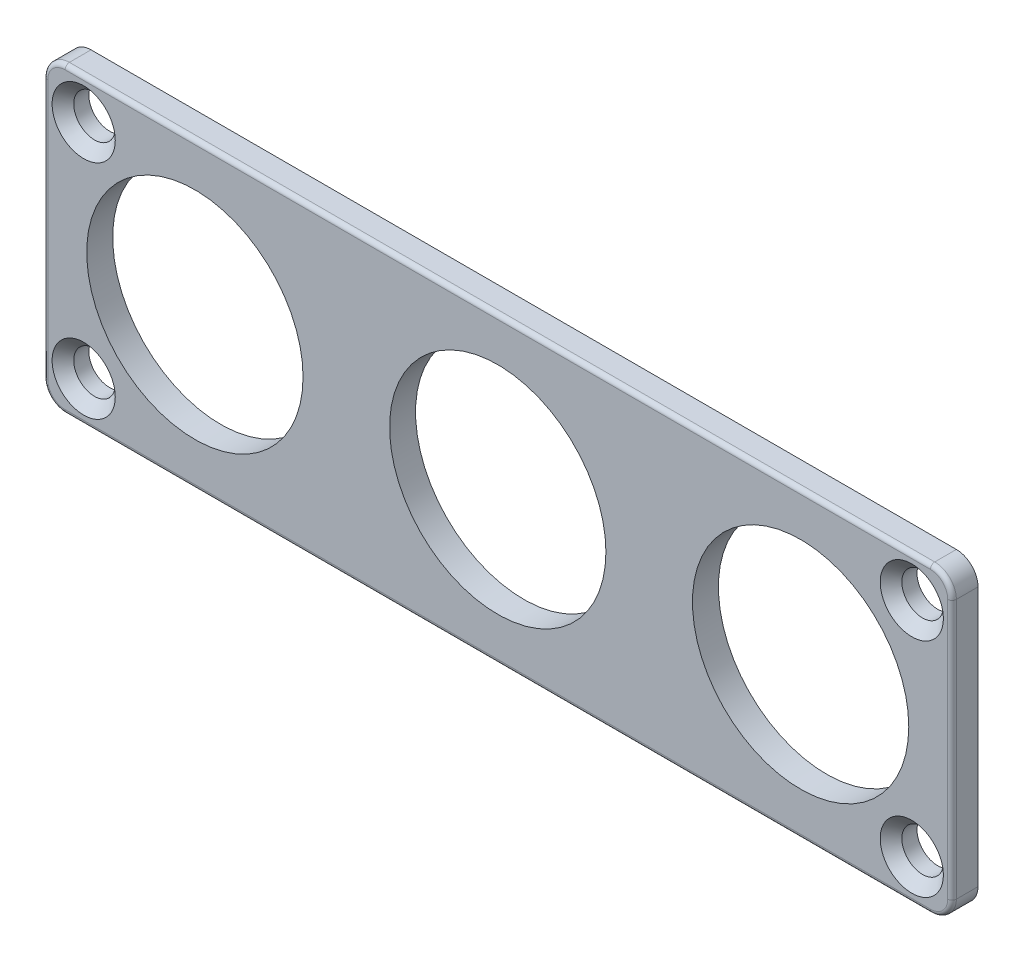
ISO-10303-21;
HEADER;
FILE_DESCRIPTION(('STEP AP214'),'2;1');
FILE_NAME('part.step','',(''),(''),'','','');
FILE_SCHEMA(('AUTOMOTIVE_DESIGN { 1 0 10303 214 1 1 1 1 }'));
ENDSEC;
DATA;
#1=APPLICATION_CONTEXT('core data for automotive mechanical design processes');
#2=APPLICATION_PROTOCOL_DEFINITION('international standard','automotive_design',2000,#1);
#3=PRODUCT_CONTEXT('',#1,'mechanical');
#4=PRODUCT('Part','Part','',(#3));
#5=PRODUCT_RELATED_PRODUCT_CATEGORY('part','',(#4));
#6=PRODUCT_DEFINITION_FORMATION('','',#4);
#7=PRODUCT_DEFINITION_CONTEXT('part definition',#1,'design');
#8=PRODUCT_DEFINITION('design','',#6,#7);
#9=PRODUCT_DEFINITION_SHAPE('','',#8);
#10=(LENGTH_UNIT() NAMED_UNIT(*) SI_UNIT(.MILLI.,.METRE.));
#11=(NAMED_UNIT(*) PLANE_ANGLE_UNIT() SI_UNIT($,.RADIAN.));
#12=(NAMED_UNIT(*) SI_UNIT($,.STERADIAN.) SOLID_ANGLE_UNIT());
#13=UNCERTAINTY_MEASURE_WITH_UNIT(LENGTH_MEASURE(1.E-05),#10,'distance_accuracy_value','');
#14=(GEOMETRIC_REPRESENTATION_CONTEXT(3) GLOBAL_UNCERTAINTY_ASSIGNED_CONTEXT((#13)) GLOBAL_UNIT_ASSIGNED_CONTEXT((#10,
#11,#12)) REPRESENTATION_CONTEXT('',''));
#15=CARTESIAN_POINT('',(0.,0.,0.));
#16=DIRECTION('',(0.,0.,1.));
#17=DIRECTION('',(1.,0.,0.));
#18=AXIS2_PLACEMENT_3D('',#15,#16,#17);
#19=CARTESIAN_POINT('',(-26.67,-8.89007476441972,-1.524));
#20=DIRECTION('',(-1.,0.,0.));
#21=DIRECTION('',(0.,0.,1.));
#22=AXIS2_PLACEMENT_3D('',#19,#20,#21);
#23=PLANE('',#22);
#24=DIRECTION('',(0.,0.,1.));
#25=VECTOR('',#24,1.);
#26=CARTESIAN_POINT('',(-26.67,-7.62007476441972,-1.524));
#27=LINE('',#26,#25);
#28=CARTESIAN_POINT('',(-26.67,-7.62007476441972,-1.524));
#29=VERTEX_POINT('',#28);
#30=CARTESIAN_POINT('',(-26.67,-7.62007476441972,-0.254));
#31=VERTEX_POINT('',#30);
#32=EDGE_CURVE('E281',#29,#31,#27,.T.);
#33=ORIENTED_EDGE('',*,*,#32,.T.);
#34=DIRECTION('',(0.,-1.,0.));
#35=VECTOR('',#34,1.);
#36=CARTESIAN_POINT('',(-26.67,-8.89007476441972,-0.254));
#37=LINE('',#36,#35);
#38=CARTESIAN_POINT('',(-26.67,7.62007476441972,-0.254));
#39=VERTEX_POINT('',#38);
#40=EDGE_CURVE('E183',#31,#39,#37,.F.);
#41=ORIENTED_EDGE('',*,*,#40,.T.);
#42=DIRECTION('',(0.,0.,1.));
#43=VECTOR('',#42,1.);
#44=CARTESIAN_POINT('',(-26.67,7.62007476441972,-1.524));
#45=LINE('',#44,#43);
#46=CARTESIAN_POINT('',(-26.67,7.62007476441972,-1.524));
#47=VERTEX_POINT('',#46);
#48=EDGE_CURVE('E284',#39,#47,#45,.F.);
#49=ORIENTED_EDGE('',*,*,#48,.T.);
#50=DIRECTION('',(0.,-1.,0.));
#51=VECTOR('',#50,1.);
#52=CARTESIAN_POINT('',(-26.67,-8.89007476441972,-1.524));
#53=LINE('',#52,#51);
#54=EDGE_CURVE('E273',#47,#29,#53,.T.);
#55=ORIENTED_EDGE('',*,*,#54,.T.);
#56=EDGE_LOOP('',(#33,#41,#49,#55));
#57=FACE_BOUND('',#56,.T.);
#58=ADVANCED_FACE('F32',(#57),#23,.T.);
#59=CARTESIAN_POINT('',(26.67,8.89007476441972,-1.524));
#60=DIRECTION('',(0.,1.,0.));
#61=DIRECTION('',(0.,0.,1.));
#62=AXIS2_PLACEMENT_3D('',#59,#60,#61);
#63=PLANE('',#62);
#64=DIRECTION('',(0.,0.,1.));
#65=VECTOR('',#64,1.);
#66=CARTESIAN_POINT('',(-25.4,8.89007476441972,-1.524));
#67=LINE('',#66,#65);
#68=CARTESIAN_POINT('',(-25.4,8.89007476441972,-1.524));
#69=VERTEX_POINT('',#68);
#70=CARTESIAN_POINT('',(-25.4,8.89007476441972,-0.254));
#71=VERTEX_POINT('',#70);
#72=EDGE_CURVE('E134',#69,#71,#67,.T.);
#73=ORIENTED_EDGE('',*,*,#72,.T.);
#74=DIRECTION('',(-1.,0.,0.));
#75=VECTOR('',#74,1.);
#76=CARTESIAN_POINT('',(26.67,8.89007476441972,-0.254));
#77=LINE('',#76,#75);
#78=CARTESIAN_POINT('',(25.4,8.89007476441972,-0.254));
#79=VERTEX_POINT('',#78);
#80=EDGE_CURVE('E130',#71,#79,#77,.F.);
#81=ORIENTED_EDGE('',*,*,#80,.T.);
#82=DIRECTION('',(0.,0.,1.));
#83=VECTOR('',#82,1.);
#84=CARTESIAN_POINT('',(25.4,8.89007476441972,-1.524));
#85=LINE('',#84,#83);
#86=CARTESIAN_POINT('',(25.4,8.89007476441972,-1.524));
#87=VERTEX_POINT('',#86);
#88=EDGE_CURVE('E123',#79,#87,#85,.F.);
#89=ORIENTED_EDGE('',*,*,#88,.T.);
#90=DIRECTION('',(-1.,0.,0.));
#91=VECTOR('',#90,1.);
#92=CARTESIAN_POINT('',(26.67,8.89007476441972,-1.524));
#93=LINE('',#92,#91);
#94=EDGE_CURVE('E127',#87,#69,#93,.T.);
#95=ORIENTED_EDGE('',*,*,#94,.T.);
#96=EDGE_LOOP('',(#73,#81,#89,#95));
#97=FACE_BOUND('',#96,.T.);
#98=ADVANCED_FACE('F126',(#97),#63,.T.);
#99=CARTESIAN_POINT('',(26.67,-8.89007476441972,-1.524));
#100=DIRECTION('',(1.,0.,0.));
#101=DIRECTION('',(0.,0.,-1.));
#102=AXIS2_PLACEMENT_3D('',#99,#100,#101);
#103=PLANE('',#102);
#104=DIRECTION('',(0.,0.,1.));
#105=VECTOR('',#104,1.);
#106=CARTESIAN_POINT('',(26.67,7.62007476441972,-1.524));
#107=LINE('',#106,#105);
#108=CARTESIAN_POINT('',(26.67,7.62007476441972,-1.524));
#109=VERTEX_POINT('',#108);
#110=CARTESIAN_POINT('',(26.67,7.62007476441972,-0.254));
#111=VERTEX_POINT('',#110);
#112=EDGE_CURVE('E148',#109,#111,#107,.T.);
#113=ORIENTED_EDGE('',*,*,#112,.T.);
#114=DIRECTION('',(0.,1.,0.));
#115=VECTOR('',#114,1.);
#116=CARTESIAN_POINT('',(26.67,-8.89007476441972,-0.254));
#117=LINE('',#116,#115);
#118=CARTESIAN_POINT('',(26.67,-7.62007476441972,-0.254));
#119=VERTEX_POINT('',#118);
#120=EDGE_CURVE('E56',#111,#119,#117,.F.);
#121=ORIENTED_EDGE('',*,*,#120,.T.);
#122=DIRECTION('',(0.,0.,1.));
#123=VECTOR('',#122,1.);
#124=CARTESIAN_POINT('',(26.67,-7.62007476441972,-1.524));
#125=LINE('',#124,#123);
#126=CARTESIAN_POINT('',(26.67,-7.62007476441972,-1.524));
#127=VERTEX_POINT('',#126);
#128=EDGE_CURVE('E151',#119,#127,#125,.F.);
#129=ORIENTED_EDGE('',*,*,#128,.T.);
#130=DIRECTION('',(0.,1.,0.));
#131=VECTOR('',#130,1.);
#132=CARTESIAN_POINT('',(26.67,-8.89007476441972,-1.524));
#133=LINE('',#132,#131);
#134=EDGE_CURVE('E144',#127,#109,#133,.T.);
#135=ORIENTED_EDGE('',*,*,#134,.T.);
#136=EDGE_LOOP('',(#113,#121,#129,#135));
#137=FACE_BOUND('',#136,.T.);
#138=ADVANCED_FACE('F323',(#137),#103,.T.);
#139=CARTESIAN_POINT('',(26.67,-8.89007476441972,-1.524));
#140=DIRECTION('',(0.,-1.,0.));
#141=DIRECTION('',(0.,0.,-1.));
#142=AXIS2_PLACEMENT_3D('',#139,#140,#141);
#143=PLANE('',#142);
#144=DIRECTION('',(0.,0.,1.));
#145=VECTOR('',#144,1.);
#146=CARTESIAN_POINT('',(25.4,-8.89007476441972,-1.524));
#147=LINE('',#146,#145);
#148=CARTESIAN_POINT('',(25.4,-8.89007476441972,-1.524));
#149=VERTEX_POINT('',#148);
#150=CARTESIAN_POINT('',(25.4,-8.89007476441972,-0.254));
#151=VERTEX_POINT('',#150);
#152=EDGE_CURVE('E161',#149,#151,#147,.T.);
#153=ORIENTED_EDGE('',*,*,#152,.T.);
#154=DIRECTION('',(1.,0.,0.));
#155=VECTOR('',#154,1.);
#156=CARTESIAN_POINT('',(26.67,-8.89007476441972,-0.254));
#157=LINE('',#156,#155);
#158=CARTESIAN_POINT('',(-25.4,-8.89007476441972,-0.254));
#159=VERTEX_POINT('',#158);
#160=EDGE_CURVE('E11',#151,#159,#157,.F.);
#161=ORIENTED_EDGE('',*,*,#160,.T.);
#162=DIRECTION('',(0.,0.,1.));
#163=VECTOR('',#162,1.);
#164=CARTESIAN_POINT('',(-25.4,-8.89007476441972,-1.524));
#165=LINE('',#164,#163);
#166=CARTESIAN_POINT('',(-25.4,-8.89007476441972,-1.524));
#167=VERTEX_POINT('',#166);
#168=EDGE_CURVE('E159',#159,#167,#165,.F.);
#169=ORIENTED_EDGE('',*,*,#168,.T.);
#170=DIRECTION('',(1.,0.,0.));
#171=VECTOR('',#170,1.);
#172=CARTESIAN_POINT('',(26.67,-8.89007476441972,-1.524));
#173=LINE('',#172,#171);
#174=EDGE_CURVE('E276',#167,#149,#173,.T.);
#175=ORIENTED_EDGE('',*,*,#174,.T.);
#176=EDGE_LOOP('',(#153,#161,#169,#175));
#177=FACE_BOUND('',#176,.T.);
#178=ADVANCED_FACE('F328',(#177),#143,.T.);
#179=CARTESIAN_POINT('',(-26.67,8.89007476441972,-1.524));
#180=DIRECTION('',(0.,0.,1.));
#181=DIRECTION('',(1.,0.,0.));
#182=AXIS2_PLACEMENT_3D('',#179,#180,#181);
#183=PLANE('',#182);
#184=CARTESIAN_POINT('',(17.7799999991657,-0.000172240006324156,-1.524));
#185=DIRECTION('',(0.,0.,1.));
#186=DIRECTION('',(1.,0.,0.));
#187=AXIS2_PLACEMENT_3D('',#184,#185,#186);
#188=CIRCLE('',#187,6.35);
#189=CARTESIAN_POINT('',(24.1299999991657,-0.000172240006324156,-1.524));
#190=VERTEX_POINT('',#189);
#191=EDGE_CURVE('E218',#190,#190,#188,.F.);
#192=ORIENTED_EDGE('',*,*,#191,.F.);
#193=EDGE_LOOP('',(#192));
#194=FACE_BOUND('',#193,.T.);
#195=CARTESIAN_POINT('',(-17.78,0.,-1.524));
#196=DIRECTION('',(0.,0.,1.));
#197=DIRECTION('',(1.,0.,0.));
#198=AXIS2_PLACEMENT_3D('',#195,#196,#197);
#199=CIRCLE('',#198,6.35);
#200=CARTESIAN_POINT('',(-11.43,0.,-1.524));
#201=VERTEX_POINT('',#200);
#202=EDGE_CURVE('E228',#201,#201,#199,.F.);
#203=ORIENTED_EDGE('',*,*,#202,.F.);
#204=EDGE_LOOP('',(#203));
#205=FACE_BOUND('',#204,.T.);
#206=CARTESIAN_POINT('',(0.,0.,-1.524));
#207=DIRECTION('',(0.,0.,1.));
#208=DIRECTION('',(1.,0.,0.));
#209=AXIS2_PLACEMENT_3D('',#206,#207,#208);
#210=CIRCLE('',#209,6.35);
#211=CARTESIAN_POINT('',(6.35,0.,-1.524));
#212=VERTEX_POINT('',#211);
#213=EDGE_CURVE('E234',#212,#212,#210,.F.);
#214=ORIENTED_EDGE('',*,*,#213,.F.);
#215=EDGE_LOOP('',(#214));
#216=FACE_BOUND('',#215,.T.);
#217=CARTESIAN_POINT('',(-24.3076797834846,6.51933074227873,-1.524));
#218=DIRECTION('',(0.,0.,1.));
#219=DIRECTION('',(1.,0.,0.));
#220=AXIS2_PLACEMENT_3D('',#217,#218,#219);
#221=CIRCLE('',#220,1.2192);
#222=CARTESIAN_POINT('',(-23.0884797834846,6.51933074227873,-1.524));
#223=VERTEX_POINT('',#222);
#224=EDGE_CURVE('E243',#223,#223,#221,.T.);
#225=ORIENTED_EDGE('',*,*,#224,.T.);
#226=EDGE_LOOP('',(#225));
#227=FACE_BOUND('',#226,.T.);
#228=CARTESIAN_POINT('',(-24.3076797834846,-6.51933074227873,-1.524));
#229=DIRECTION('',(0.,0.,1.));
#230=DIRECTION('',(1.,0.,0.));
#231=AXIS2_PLACEMENT_3D('',#228,#229,#230);
#232=CIRCLE('',#231,1.2192);
#233=CARTESIAN_POINT('',(-23.0884797834846,-6.51933074227873,-1.524));
#234=VERTEX_POINT('',#233);
#235=EDGE_CURVE('E252',#234,#234,#232,.T.);
#236=ORIENTED_EDGE('',*,*,#235,.T.);
#237=EDGE_LOOP('',(#236));
#238=FACE_BOUND('',#237,.T.);
#239=CARTESIAN_POINT('',(24.3076797834846,-6.51933074227873,-1.524));
#240=DIRECTION('',(0.,0.,1.));
#241=DIRECTION('',(1.,0.,0.));
#242=AXIS2_PLACEMENT_3D('',#239,#240,#241);
#243=CIRCLE('',#242,1.2192);
#244=CARTESIAN_POINT('',(25.5268797834846,-6.51933074227873,-1.524));
#245=VERTEX_POINT('',#244);
#246=EDGE_CURVE('E261',#245,#245,#243,.T.);
#247=ORIENTED_EDGE('',*,*,#246,.T.);
#248=EDGE_LOOP('',(#247));
#249=FACE_BOUND('',#248,.T.);
#250=CARTESIAN_POINT('',(24.3076797834846,6.51933074227873,-1.524));
#251=DIRECTION('',(0.,0.,1.));
#252=DIRECTION('',(1.,0.,0.));
#253=AXIS2_PLACEMENT_3D('',#250,#251,#252);
#254=CIRCLE('',#253,1.2192);
#255=CARTESIAN_POINT('',(25.5268797834846,6.51933074227873,-1.524));
#256=VERTEX_POINT('',#255);
#257=EDGE_CURVE('E270',#256,#256,#254,.T.);
#258=ORIENTED_EDGE('',*,*,#257,.T.);
#259=EDGE_LOOP('',(#258));
#260=FACE_BOUND('',#259,.T.);
#261=ORIENTED_EDGE('',*,*,#54,.F.);
#262=CARTESIAN_POINT('',(-25.4,7.62007476441972,-1.524));
#263=DIRECTION('',(0.,0.,1.));
#264=DIRECTION('',(1.,0.,0.));
#265=AXIS2_PLACEMENT_3D('',#262,#263,#264);
#266=CIRCLE('',#265,1.27);
#267=EDGE_CURVE('E143',#47,#69,#266,.F.);
#268=ORIENTED_EDGE('',*,*,#267,.T.);
#269=ORIENTED_EDGE('',*,*,#94,.F.);
#270=CARTESIAN_POINT('',(25.4,7.62007476441972,-1.524));
#271=DIRECTION('',(0.,0.,1.));
#272=DIRECTION('',(1.,0.,0.));
#273=AXIS2_PLACEMENT_3D('',#270,#271,#272);
#274=CIRCLE('',#273,1.27);
#275=EDGE_CURVE('E140',#87,#109,#274,.F.);
#276=ORIENTED_EDGE('',*,*,#275,.T.);
#277=ORIENTED_EDGE('',*,*,#134,.F.);
#278=CARTESIAN_POINT('',(25.4,-7.62007476441972,-1.524));
#279=DIRECTION('',(0.,0.,1.));
#280=DIRECTION('',(1.,0.,0.));
#281=AXIS2_PLACEMENT_3D('',#278,#279,#280);
#282=CIRCLE('',#281,1.27);
#283=EDGE_CURVE('E149',#127,#149,#282,.F.);
#284=ORIENTED_EDGE('',*,*,#283,.T.);
#285=ORIENTED_EDGE('',*,*,#174,.F.);
#286=CARTESIAN_POINT('',(-25.4,-7.62007476441972,-1.524));
#287=DIRECTION('',(0.,0.,1.));
#288=DIRECTION('',(1.,0.,0.));
#289=AXIS2_PLACEMENT_3D('',#286,#287,#288);
#290=CIRCLE('',#289,1.27);
#291=EDGE_CURVE('E153',#167,#29,#290,.F.);
#292=ORIENTED_EDGE('',*,*,#291,.T.);
#293=EDGE_LOOP('',(#261,#268,#269,#276,#277,#284,#285,#292));
#294=FACE_BOUND('',#293,.T.);
#295=ADVANCED_FACE('F138',(#194,#205,#216,#227,#238,#249,#260,#294),#183,.F.);
#296=CARTESIAN_POINT('',(-26.67,8.89007476441972,0.));
#297=DIRECTION('',(0.,0.,1.));
#298=DIRECTION('',(1.,0.,0.));
#299=AXIS2_PLACEMENT_3D('',#296,#297,#298);
#300=PLANE('',#299);
#301=DIRECTION('',(0.,-1.,0.));
#302=VECTOR('',#301,1.);
#303=CARTESIAN_POINT('',(-26.416,8.89007476441972,0.));
#304=LINE('',#303,#302);
#305=CARTESIAN_POINT('',(-26.416,7.62007476441972,0.));
#306=VERTEX_POINT('',#305);
#307=CARTESIAN_POINT('',(-26.416,-7.62007476441972,0.));
#308=VERTEX_POINT('',#307);
#309=EDGE_CURVE('E175',#306,#308,#304,.T.);
#310=ORIENTED_EDGE('',*,*,#309,.T.);
#311=CARTESIAN_POINT('',(-25.4,-7.62007476441972,0.));
#312=DIRECTION('',(0.,0.,1.));
#313=DIRECTION('',(1.,0.,0.));
#314=AXIS2_PLACEMENT_3D('',#311,#312,#313);
#315=CIRCLE('',#314,1.016);
#316=CARTESIAN_POINT('',(-25.4,-8.63607476441972,0.));
#317=VERTEX_POINT('',#316);
#318=EDGE_CURVE('E177',#308,#317,#315,.T.);
#319=ORIENTED_EDGE('',*,*,#318,.T.);
#320=DIRECTION('',(1.,0.,0.));
#321=VECTOR('',#320,1.);
#322=CARTESIAN_POINT('',(-26.67,-8.63607476441972,0.));
#323=LINE('',#322,#321);
#324=CARTESIAN_POINT('',(25.4,-8.63607476441972,0.));
#325=VERTEX_POINT('',#324);
#326=EDGE_CURVE('E163',#317,#325,#323,.T.);
#327=ORIENTED_EDGE('',*,*,#326,.T.);
#328=CARTESIAN_POINT('',(25.4,-7.62007476441972,0.));
#329=DIRECTION('',(0.,0.,1.));
#330=DIRECTION('',(1.,0.,0.));
#331=AXIS2_PLACEMENT_3D('',#328,#329,#330);
#332=CIRCLE('',#331,1.016);
#333=CARTESIAN_POINT('',(26.416,-7.62007476441972,0.));
#334=VERTEX_POINT('',#333);
#335=EDGE_CURVE('E165',#325,#334,#332,.T.);
#336=ORIENTED_EDGE('',*,*,#335,.T.);
#337=DIRECTION('',(0.,1.,0.));
#338=VECTOR('',#337,1.);
#339=CARTESIAN_POINT('',(26.416,8.89007476441972,0.));
#340=LINE('',#339,#338);
#341=CARTESIAN_POINT('',(26.416,7.62007476441972,0.));
#342=VERTEX_POINT('',#341);
#343=EDGE_CURVE('E167',#334,#342,#340,.T.);
#344=ORIENTED_EDGE('',*,*,#343,.T.);
#345=CARTESIAN_POINT('',(25.4,7.62007476441972,0.));
#346=DIRECTION('',(0.,0.,1.));
#347=DIRECTION('',(1.,0.,0.));
#348=AXIS2_PLACEMENT_3D('',#345,#346,#347);
#349=CIRCLE('',#348,1.016);
#350=CARTESIAN_POINT('',(25.4,8.63607476441972,0.));
#351=VERTEX_POINT('',#350);
#352=EDGE_CURVE('E169',#342,#351,#349,.T.);
#353=ORIENTED_EDGE('',*,*,#352,.T.);
#354=DIRECTION('',(-1.,0.,0.));
#355=VECTOR('',#354,1.);
#356=CARTESIAN_POINT('',(-26.67,8.63607476441972,0.));
#357=LINE('',#356,#355);
#358=CARTESIAN_POINT('',(-25.4,8.63607476441972,0.));
#359=VERTEX_POINT('',#358);
#360=EDGE_CURVE('E171',#351,#359,#357,.T.);
#361=ORIENTED_EDGE('',*,*,#360,.T.);
#362=CARTESIAN_POINT('',(-25.4,7.62007476441972,0.));
#363=DIRECTION('',(0.,0.,1.));
#364=DIRECTION('',(1.,0.,0.));
#365=AXIS2_PLACEMENT_3D('',#362,#363,#364);
#366=CIRCLE('',#365,1.016);
#367=EDGE_CURVE('E173',#359,#306,#366,.T.);
#368=ORIENTED_EDGE('',*,*,#367,.T.);
#369=EDGE_LOOP('',(#310,#319,#327,#336,#344,#353,#361,#368));
#370=FACE_BOUND('',#369,.T.);
#371=CARTESIAN_POINT('',(17.7799999991657,-0.000172240006324156,0.));
#372=DIRECTION('',(0.,0.,1.));
#373=DIRECTION('',(1.,0.,0.));
#374=AXIS2_PLACEMENT_3D('',#371,#372,#373);
#375=CIRCLE('',#374,6.35);
#376=CARTESIAN_POINT('',(24.1299999991657,-0.000172240006324156,0.));
#377=VERTEX_POINT('',#376);
#378=EDGE_CURVE('E213',#377,#377,#375,.T.);
#379=ORIENTED_EDGE('',*,*,#378,.F.);
#380=EDGE_LOOP('',(#379));
#381=FACE_BOUND('',#380,.T.);
#382=CARTESIAN_POINT('',(-17.78,0.,0.));
#383=DIRECTION('',(0.,0.,1.));
#384=DIRECTION('',(1.,0.,0.));
#385=AXIS2_PLACEMENT_3D('',#382,#383,#384);
#386=CIRCLE('',#385,6.35);
#387=CARTESIAN_POINT('',(-11.43,0.,0.));
#388=VERTEX_POINT('',#387);
#389=EDGE_CURVE('E223',#388,#388,#386,.T.);
#390=ORIENTED_EDGE('',*,*,#389,.F.);
#391=EDGE_LOOP('',(#390));
#392=FACE_BOUND('',#391,.T.);
#393=CARTESIAN_POINT('',(0.,0.,0.));
#394=DIRECTION('',(0.,0.,1.));
#395=DIRECTION('',(1.,0.,0.));
#396=AXIS2_PLACEMENT_3D('',#393,#394,#395);
#397=CIRCLE('',#396,6.35);
#398=CARTESIAN_POINT('',(6.35,0.,0.));
#399=VERTEX_POINT('',#398);
#400=EDGE_CURVE('E231',#399,#399,#397,.T.);
#401=ORIENTED_EDGE('',*,*,#400,.F.);
#402=EDGE_LOOP('',(#401));
#403=FACE_BOUND('',#402,.T.);
#404=CARTESIAN_POINT('',(-24.3076797834846,6.51933074227873,0.));
#405=DIRECTION('',(0.,0.,1.));
#406=DIRECTION('',(1.,0.,0.));
#407=AXIS2_PLACEMENT_3D('',#404,#405,#406);
#408=CIRCLE('',#407,1.8542);
#409=CARTESIAN_POINT('',(-22.4534797834846,6.51933074227873,0.));
#410=VERTEX_POINT('',#409);
#411=EDGE_CURVE('E237',#410,#410,#408,.T.);
#412=ORIENTED_EDGE('',*,*,#411,.F.);
#413=EDGE_LOOP('',(#412));
#414=FACE_BOUND('',#413,.T.);
#415=CARTESIAN_POINT('',(-24.3076797834846,-6.51933074227873,0.));
#416=DIRECTION('',(0.,0.,1.));
#417=DIRECTION('',(1.,0.,0.));
#418=AXIS2_PLACEMENT_3D('',#415,#416,#417);
#419=CIRCLE('',#418,1.8542);
#420=CARTESIAN_POINT('',(-22.4534797834846,-6.51933074227873,0.));
#421=VERTEX_POINT('',#420);
#422=EDGE_CURVE('E246',#421,#421,#419,.T.);
#423=ORIENTED_EDGE('',*,*,#422,.F.);
#424=EDGE_LOOP('',(#423));
#425=FACE_BOUND('',#424,.T.);
#426=CARTESIAN_POINT('',(24.3076797834846,-6.51933074227873,0.));
#427=DIRECTION('',(0.,0.,1.));
#428=DIRECTION('',(1.,0.,0.));
#429=AXIS2_PLACEMENT_3D('',#426,#427,#428);
#430=CIRCLE('',#429,1.8542);
#431=CARTESIAN_POINT('',(26.1618797834846,-6.51933074227873,0.));
#432=VERTEX_POINT('',#431);
#433=EDGE_CURVE('E255',#432,#432,#430,.T.);
#434=ORIENTED_EDGE('',*,*,#433,.F.);
#435=EDGE_LOOP('',(#434));
#436=FACE_BOUND('',#435,.T.);
#437=CARTESIAN_POINT('',(24.3076797834846,6.51933074227873,0.));
#438=DIRECTION('',(0.,0.,1.));
#439=DIRECTION('',(1.,0.,0.));
#440=AXIS2_PLACEMENT_3D('',#437,#438,#439);
#441=CIRCLE('',#440,1.8542);
#442=CARTESIAN_POINT('',(26.1618797834846,6.51933074227873,0.));
#443=VERTEX_POINT('',#442);
#444=EDGE_CURVE('E264',#443,#443,#441,.T.);
#445=ORIENTED_EDGE('',*,*,#444,.F.);
#446=EDGE_LOOP('',(#445));
#447=FACE_BOUND('',#446,.T.);
#448=ADVANCED_FACE('F307',(#370,#381,#392,#403,#414,#425,#436,#447),#300,.T.);
#449=CARTESIAN_POINT('',(24.3076797834846,6.51933074227873,0.));
#450=DIRECTION('',(0.,0.,1.));
#451=DIRECTION('',(1.,0.,0.));
#452=AXIS2_PLACEMENT_3D('',#449,#450,#451);
#453=CYLINDRICAL_SURFACE('',#452,1.2192);
#454=ORIENTED_EDGE('',*,*,#257,.F.);
#455=EDGE_LOOP('',(#454));
#456=FACE_BOUND('',#455,.T.);
#457=CARTESIAN_POINT('',(24.3076797834846,6.51933074227873,-0.635));
#458=DIRECTION('',(0.,0.,1.));
#459=DIRECTION('',(1.,0.,0.));
#460=AXIS2_PLACEMENT_3D('',#457,#458,#459);
#461=CIRCLE('',#460,1.2192);
#462=CARTESIAN_POINT('',(25.5268797834846,6.51933074227873,-0.635));
#463=VERTEX_POINT('',#462);
#464=EDGE_CURVE('E267',#463,#463,#461,.T.);
#465=ORIENTED_EDGE('',*,*,#464,.T.);
#466=EDGE_LOOP('',(#465));
#467=FACE_BOUND('',#466,.T.);
#468=ADVANCED_FACE('F517',(#456,#467),#453,.F.);
#469=CARTESIAN_POINT('',(24.3076797834846,6.51933074227873,0.));
#470=DIRECTION('',(0.,0.,1.));
#471=DIRECTION('',(1.,0.,0.));
#472=AXIS2_PLACEMENT_3D('',#469,#470,#471);
#473=CONICAL_SURFACE('',#472,1.8542,0.785398163397447);
#474=ORIENTED_EDGE('',*,*,#464,.F.);
#475=EDGE_LOOP('',(#474));
#476=FACE_BOUND('',#475,.T.);
#477=ORIENTED_EDGE('',*,*,#444,.T.);
#478=EDGE_LOOP('',(#477));
#479=FACE_BOUND('',#478,.T.);
#480=ADVANCED_FACE('F508',(#476,#479),#473,.F.);
#481=CARTESIAN_POINT('',(24.3076797834846,-6.51933074227873,0.));
#482=DIRECTION('',(0.,0.,1.));
#483=DIRECTION('',(1.,0.,0.));
#484=AXIS2_PLACEMENT_3D('',#481,#482,#483);
#485=CYLINDRICAL_SURFACE('',#484,1.2192);
#486=ORIENTED_EDGE('',*,*,#246,.F.);
#487=EDGE_LOOP('',(#486));
#488=FACE_BOUND('',#487,.T.);
#489=CARTESIAN_POINT('',(24.3076797834846,-6.51933074227873,-0.635));
#490=DIRECTION('',(0.,0.,1.));
#491=DIRECTION('',(1.,0.,0.));
#492=AXIS2_PLACEMENT_3D('',#489,#490,#491);
#493=CIRCLE('',#492,1.2192);
#494=CARTESIAN_POINT('',(25.5268797834846,-6.51933074227873,-0.635));
#495=VERTEX_POINT('',#494);
#496=EDGE_CURVE('E258',#495,#495,#493,.T.);
#497=ORIENTED_EDGE('',*,*,#496,.T.);
#498=EDGE_LOOP('',(#497));
#499=FACE_BOUND('',#498,.T.);
#500=ADVANCED_FACE('F499',(#488,#499),#485,.F.);
#501=CARTESIAN_POINT('',(24.3076797834846,-6.51933074227873,0.));
#502=DIRECTION('',(0.,0.,1.));
#503=DIRECTION('',(1.,0.,0.));
#504=AXIS2_PLACEMENT_3D('',#501,#502,#503);
#505=CONICAL_SURFACE('',#504,1.8542,0.785398163397447);
#506=ORIENTED_EDGE('',*,*,#496,.F.);
#507=EDGE_LOOP('',(#506));
#508=FACE_BOUND('',#507,.T.);
#509=ORIENTED_EDGE('',*,*,#433,.T.);
#510=EDGE_LOOP('',(#509));
#511=FACE_BOUND('',#510,.T.);
#512=ADVANCED_FACE('F490',(#508,#511),#505,.F.);
#513=CARTESIAN_POINT('',(-24.3076797834846,-6.51933074227873,0.));
#514=DIRECTION('',(0.,0.,1.));
#515=DIRECTION('',(1.,0.,0.));
#516=AXIS2_PLACEMENT_3D('',#513,#514,#515);
#517=CYLINDRICAL_SURFACE('',#516,1.2192);
#518=ORIENTED_EDGE('',*,*,#235,.F.);
#519=EDGE_LOOP('',(#518));
#520=FACE_BOUND('',#519,.T.);
#521=CARTESIAN_POINT('',(-24.3076797834846,-6.51933074227873,-0.635));
#522=DIRECTION('',(0.,0.,1.));
#523=DIRECTION('',(1.,0.,0.));
#524=AXIS2_PLACEMENT_3D('',#521,#522,#523);
#525=CIRCLE('',#524,1.2192);
#526=CARTESIAN_POINT('',(-23.0884797834846,-6.51933074227873,-0.635));
#527=VERTEX_POINT('',#526);
#528=EDGE_CURVE('E249',#527,#527,#525,.T.);
#529=ORIENTED_EDGE('',*,*,#528,.T.);
#530=EDGE_LOOP('',(#529));
#531=FACE_BOUND('',#530,.T.);
#532=ADVANCED_FACE('F481',(#520,#531),#517,.F.);
#533=CARTESIAN_POINT('',(-24.3076797834846,-6.51933074227873,0.));
#534=DIRECTION('',(0.,0.,1.));
#535=DIRECTION('',(1.,0.,0.));
#536=AXIS2_PLACEMENT_3D('',#533,#534,#535);
#537=CONICAL_SURFACE('',#536,1.8542,0.785398163397447);
#538=ORIENTED_EDGE('',*,*,#528,.F.);
#539=EDGE_LOOP('',(#538));
#540=FACE_BOUND('',#539,.T.);
#541=ORIENTED_EDGE('',*,*,#422,.T.);
#542=EDGE_LOOP('',(#541));
#543=FACE_BOUND('',#542,.T.);
#544=ADVANCED_FACE('F472',(#540,#543),#537,.F.);
#545=CARTESIAN_POINT('',(-24.3076797834846,6.51933074227873,0.));
#546=DIRECTION('',(0.,0.,1.));
#547=DIRECTION('',(1.,0.,0.));
#548=AXIS2_PLACEMENT_3D('',#545,#546,#547);
#549=CYLINDRICAL_SURFACE('',#548,1.2192);
#550=ORIENTED_EDGE('',*,*,#224,.F.);
#551=EDGE_LOOP('',(#550));
#552=FACE_BOUND('',#551,.T.);
#553=CARTESIAN_POINT('',(-24.3076797834846,6.51933074227873,-0.635));
#554=DIRECTION('',(0.,0.,1.));
#555=DIRECTION('',(1.,0.,0.));
#556=AXIS2_PLACEMENT_3D('',#553,#554,#555);
#557=CIRCLE('',#556,1.2192);
#558=CARTESIAN_POINT('',(-23.0884797834846,6.51933074227873,-0.635));
#559=VERTEX_POINT('',#558);
#560=EDGE_CURVE('E240',#559,#559,#557,.T.);
#561=ORIENTED_EDGE('',*,*,#560,.T.);
#562=EDGE_LOOP('',(#561));
#563=FACE_BOUND('',#562,.T.);
#564=ADVANCED_FACE('F463',(#552,#563),#549,.F.);
#565=CARTESIAN_POINT('',(-24.3076797834846,6.51933074227873,0.));
#566=DIRECTION('',(0.,0.,1.));
#567=DIRECTION('',(1.,0.,0.));
#568=AXIS2_PLACEMENT_3D('',#565,#566,#567);
#569=CONICAL_SURFACE('',#568,1.8542,0.785398163397447);
#570=ORIENTED_EDGE('',*,*,#560,.F.);
#571=EDGE_LOOP('',(#570));
#572=FACE_BOUND('',#571,.T.);
#573=ORIENTED_EDGE('',*,*,#411,.T.);
#574=EDGE_LOOP('',(#573));
#575=FACE_BOUND('',#574,.T.);
#576=ADVANCED_FACE('F350',(#572,#575),#569,.F.);
#577=CARTESIAN_POINT('',(-25.4,7.62007476441972,-1.524));
#578=DIRECTION('',(0.,0.,1.));
#579=DIRECTION('',(1.,0.,0.));
#580=AXIS2_PLACEMENT_3D('',#577,#578,#579);
#581=CYLINDRICAL_SURFACE('',#580,1.27);
#582=ORIENTED_EDGE('',*,*,#48,.F.);
#583=CARTESIAN_POINT('',(-25.4,7.62007476441972,-0.254));
#584=DIRECTION('',(0.,0.,1.));
#585=DIRECTION('',(1.,0.,0.));
#586=AXIS2_PLACEMENT_3D('',#583,#584,#585);
#587=CIRCLE('',#586,1.27);
#588=EDGE_CURVE('E185',#39,#71,#587,.F.);
#589=ORIENTED_EDGE('',*,*,#588,.T.);
#590=ORIENTED_EDGE('',*,*,#72,.F.);
#591=ORIENTED_EDGE('',*,*,#267,.F.);
#592=EDGE_LOOP('',(#582,#589,#590,#591));
#593=FACE_BOUND('',#592,.T.);
#594=ADVANCED_FACE('F316',(#593),#581,.T.);
#595=CARTESIAN_POINT('',(25.4,7.62007476441972,-1.524));
#596=DIRECTION('',(0.,0.,1.));
#597=DIRECTION('',(1.,0.,0.));
#598=AXIS2_PLACEMENT_3D('',#595,#596,#597);
#599=CYLINDRICAL_SURFACE('',#598,1.27);
#600=ORIENTED_EDGE('',*,*,#88,.F.);
#601=CARTESIAN_POINT('',(25.4,7.62007476441972,-0.254));
#602=DIRECTION('',(0.,0.,1.));
#603=DIRECTION('',(1.,0.,0.));
#604=AXIS2_PLACEMENT_3D('',#601,#602,#603);
#605=CIRCLE('',#604,1.27);
#606=EDGE_CURVE('E188',#79,#111,#605,.F.);
#607=ORIENTED_EDGE('',*,*,#606,.T.);
#608=ORIENTED_EDGE('',*,*,#112,.F.);
#609=ORIENTED_EDGE('',*,*,#275,.F.);
#610=EDGE_LOOP('',(#600,#607,#608,#609));
#611=FACE_BOUND('',#610,.T.);
#612=ADVANCED_FACE('F147',(#611),#599,.T.);
#613=CARTESIAN_POINT('',(25.4,-7.62007476441972,-1.524));
#614=DIRECTION('',(0.,0.,1.));
#615=DIRECTION('',(1.,0.,0.));
#616=AXIS2_PLACEMENT_3D('',#613,#614,#615);
#617=CYLINDRICAL_SURFACE('',#616,1.27);
#618=ORIENTED_EDGE('',*,*,#128,.F.);
#619=CARTESIAN_POINT('',(25.4,-7.62007476441972,-0.254));
#620=DIRECTION('',(0.,0.,1.));
#621=DIRECTION('',(1.,0.,0.));
#622=AXIS2_PLACEMENT_3D('',#619,#620,#621);
#623=CIRCLE('',#622,1.27);
#624=EDGE_CURVE('E41',#119,#151,#623,.F.);
#625=ORIENTED_EDGE('',*,*,#624,.T.);
#626=ORIENTED_EDGE('',*,*,#152,.F.);
#627=ORIENTED_EDGE('',*,*,#283,.F.);
#628=EDGE_LOOP('',(#618,#625,#626,#627));
#629=FACE_BOUND('',#628,.T.);
#630=ADVANCED_FACE('F325',(#629),#617,.T.);
#631=CARTESIAN_POINT('',(-25.4,-7.62007476441972,-1.524));
#632=DIRECTION('',(0.,0.,1.));
#633=DIRECTION('',(1.,0.,0.));
#634=AXIS2_PLACEMENT_3D('',#631,#632,#633);
#635=CYLINDRICAL_SURFACE('',#634,1.27);
#636=ORIENTED_EDGE('',*,*,#168,.F.);
#637=CARTESIAN_POINT('',(-25.4,-7.62007476441972,-0.254));
#638=DIRECTION('',(0.,0.,1.));
#639=DIRECTION('',(1.,0.,0.));
#640=AXIS2_PLACEMENT_3D('',#637,#638,#639);
#641=CIRCLE('',#640,1.27);
#642=EDGE_CURVE('E180',#159,#31,#641,.F.);
#643=ORIENTED_EDGE('',*,*,#642,.T.);
#644=ORIENTED_EDGE('',*,*,#32,.F.);
#645=ORIENTED_EDGE('',*,*,#291,.F.);
#646=EDGE_LOOP('',(#636,#643,#644,#645));
#647=FACE_BOUND('',#646,.T.);
#648=ADVANCED_FACE('F292',(#647),#635,.T.);
#649=CARTESIAN_POINT('',(0.,0.,-1.525));
#650=DIRECTION('',(0.,0.,1.));
#651=DIRECTION('',(1.,0.,0.));
#652=AXIS2_PLACEMENT_3D('',#649,#650,#651);
#653=CYLINDRICAL_SURFACE('',#652,6.35);
#654=ORIENTED_EDGE('',*,*,#400,.T.);
#655=EDGE_LOOP('',(#654));
#656=FACE_BOUND('',#655,.T.);
#657=ORIENTED_EDGE('',*,*,#213,.T.);
#658=EDGE_LOOP('',(#657));
#659=FACE_BOUND('',#658,.T.);
#660=ADVANCED_FACE('F357',(#656,#659),#653,.F.);
#661=CARTESIAN_POINT('',(-17.78,0.,-1.525));
#662=DIRECTION('',(0.,0.,1.));
#663=DIRECTION('',(1.,0.,0.));
#664=AXIS2_PLACEMENT_3D('',#661,#662,#663);
#665=CYLINDRICAL_SURFACE('',#664,6.35);
#666=ORIENTED_EDGE('',*,*,#389,.T.);
#667=EDGE_LOOP('',(#666));
#668=FACE_BOUND('',#667,.T.);
#669=ORIENTED_EDGE('',*,*,#202,.T.);
#670=EDGE_LOOP('',(#669));
#671=FACE_BOUND('',#670,.T.);
#672=ADVANCED_FACE('F418',(#668,#671),#665,.F.);
#673=CARTESIAN_POINT('',(17.7799999991657,-0.000172240006324156,-1.525));
#674=DIRECTION('',(0.,0.,1.));
#675=DIRECTION('',(1.,0.,0.));
#676=AXIS2_PLACEMENT_3D('',#673,#674,#675);
#677=CYLINDRICAL_SURFACE('',#676,6.35);
#678=ORIENTED_EDGE('',*,*,#378,.T.);
#679=EDGE_LOOP('',(#678));
#680=FACE_BOUND('',#679,.T.);
#681=ORIENTED_EDGE('',*,*,#191,.T.);
#682=EDGE_LOOP('',(#681));
#683=FACE_BOUND('',#682,.T.);
#684=ADVANCED_FACE('F410',(#680,#683),#677,.F.);
#685=CARTESIAN_POINT('',(25.4,7.62007476441972,-0.254));
#686=DIRECTION('',(0.,0.,1.));
#687=DIRECTION('',(1.,0.,0.));
#688=AXIS2_PLACEMENT_3D('',#685,#686,#687);
#689=TOROIDAL_SURFACE('',#688,1.016,0.254);
#690=CARTESIAN_POINT('',(26.416,7.62007476441972,-0.254));
#691=DIRECTION('',(0.,-1.,0.));
#692=DIRECTION('',(0.,0.,-1.));
#693=AXIS2_PLACEMENT_3D('',#690,#691,#692);
#694=CIRCLE('',#693,0.254);
#695=EDGE_CURVE('E207',#111,#342,#694,.T.);
#696=ORIENTED_EDGE('',*,*,#695,.F.);
#697=ORIENTED_EDGE('',*,*,#606,.F.);
#698=CARTESIAN_POINT('',(25.4,8.63607476441972,-0.254));
#699=DIRECTION('',(-1.,0.,0.));
#700=DIRECTION('',(0.,0.,1.));
#701=AXIS2_PLACEMENT_3D('',#698,#699,#700);
#702=CIRCLE('',#701,0.254);
#703=EDGE_CURVE('E36',#351,#79,#702,.T.);
#704=ORIENTED_EDGE('',*,*,#703,.F.);
#705=ORIENTED_EDGE('',*,*,#352,.F.);
#706=EDGE_LOOP('',(#696,#697,#704,#705));
#707=FACE_BOUND('',#706,.T.);
#708=ADVANCED_FACE('F34',(#707),#689,.T.);
#709=CARTESIAN_POINT('',(-26.67,8.63607476441972,-0.254));
#710=DIRECTION('',(-1.,0.,0.));
#711=DIRECTION('',(0.,0.,1.));
#712=AXIS2_PLACEMENT_3D('',#709,#710,#711);
#713=CYLINDRICAL_SURFACE('',#712,0.254);
#714=ORIENTED_EDGE('',*,*,#703,.T.);
#715=ORIENTED_EDGE('',*,*,#80,.F.);
#716=CARTESIAN_POINT('',(-25.4,8.63607476441972,-0.254));
#717=DIRECTION('',(-1.,0.,0.));
#718=DIRECTION('',(0.,0.,1.));
#719=AXIS2_PLACEMENT_3D('',#716,#717,#718);
#720=CIRCLE('',#719,0.254);
#721=EDGE_CURVE('E205',#359,#71,#720,.T.);
#722=ORIENTED_EDGE('',*,*,#721,.F.);
#723=ORIENTED_EDGE('',*,*,#360,.F.);
#724=EDGE_LOOP('',(#714,#715,#722,#723));
#725=FACE_BOUND('',#724,.T.);
#726=ADVANCED_FACE('F320',(#725),#713,.T.);
#727=CARTESIAN_POINT('',(26.416,8.89007476441972,-0.254));
#728=DIRECTION('',(0.,1.,0.));
#729=DIRECTION('',(0.,0.,1.));
#730=AXIS2_PLACEMENT_3D('',#727,#728,#729);
#731=CYLINDRICAL_SURFACE('',#730,0.254);
#732=ORIENTED_EDGE('',*,*,#695,.T.);
#733=ORIENTED_EDGE('',*,*,#343,.F.);
#734=CARTESIAN_POINT('',(26.416,-7.62007476441972,-0.254));
#735=DIRECTION('',(0.,-1.,0.));
#736=DIRECTION('',(0.,0.,-1.));
#737=AXIS2_PLACEMENT_3D('',#734,#735,#736);
#738=CIRCLE('',#737,0.254);
#739=EDGE_CURVE('E202',#119,#334,#738,.T.);
#740=ORIENTED_EDGE('',*,*,#739,.F.);
#741=ORIENTED_EDGE('',*,*,#120,.F.);
#742=EDGE_LOOP('',(#732,#733,#740,#741));
#743=FACE_BOUND('',#742,.T.);
#744=ADVANCED_FACE('F331',(#743),#731,.T.);
#745=CARTESIAN_POINT('',(-25.4,7.62007476441972,-0.254));
#746=DIRECTION('',(0.,0.,1.));
#747=DIRECTION('',(1.,0.,0.));
#748=AXIS2_PLACEMENT_3D('',#745,#746,#747);
#749=TOROIDAL_SURFACE('',#748,1.016,0.254);
#750=ORIENTED_EDGE('',*,*,#721,.T.);
#751=ORIENTED_EDGE('',*,*,#588,.F.);
#752=CARTESIAN_POINT('',(-26.416,7.62007476441972,-0.254));
#753=DIRECTION('',(0.,-1.,0.));
#754=DIRECTION('',(0.,0.,-1.));
#755=AXIS2_PLACEMENT_3D('',#752,#753,#754);
#756=CIRCLE('',#755,0.254);
#757=EDGE_CURVE('E199',#306,#39,#756,.T.);
#758=ORIENTED_EDGE('',*,*,#757,.F.);
#759=ORIENTED_EDGE('',*,*,#367,.F.);
#760=EDGE_LOOP('',(#750,#751,#758,#759));
#761=FACE_BOUND('',#760,.T.);
#762=ADVANCED_FACE('F318',(#761),#749,.T.);
#763=CARTESIAN_POINT('',(25.4,-7.62007476441972,-0.254));
#764=DIRECTION('',(0.,0.,1.));
#765=DIRECTION('',(1.,0.,0.));
#766=AXIS2_PLACEMENT_3D('',#763,#764,#765);
#767=TOROIDAL_SURFACE('',#766,1.016,0.254);
#768=ORIENTED_EDGE('',*,*,#739,.T.);
#769=ORIENTED_EDGE('',*,*,#335,.F.);
#770=CARTESIAN_POINT('',(25.4,-8.63607476441972,-0.254));
#771=DIRECTION('',(-1.,0.,0.));
#772=DIRECTION('',(0.,0.,1.));
#773=AXIS2_PLACEMENT_3D('',#770,#771,#772);
#774=CIRCLE('',#773,0.254);
#775=EDGE_CURVE('E196',#151,#325,#774,.T.);
#776=ORIENTED_EDGE('',*,*,#775,.F.);
#777=ORIENTED_EDGE('',*,*,#624,.F.);
#778=EDGE_LOOP('',(#768,#769,#776,#777));
#779=FACE_BOUND('',#778,.T.);
#780=ADVANCED_FACE('F330',(#779),#767,.T.);
#781=CARTESIAN_POINT('',(-26.416,8.89007476441972,-0.254));
#782=DIRECTION('',(0.,-1.,0.));
#783=DIRECTION('',(0.,0.,-1.));
#784=AXIS2_PLACEMENT_3D('',#781,#782,#783);
#785=CYLINDRICAL_SURFACE('',#784,0.254);
#786=ORIENTED_EDGE('',*,*,#757,.T.);
#787=ORIENTED_EDGE('',*,*,#40,.F.);
#788=CARTESIAN_POINT('',(-26.416,-7.62007476441972,-0.254));
#789=DIRECTION('',(0.,-1.,0.));
#790=DIRECTION('',(0.,0.,-1.));
#791=AXIS2_PLACEMENT_3D('',#788,#789,#790);
#792=CIRCLE('',#791,0.254);
#793=EDGE_CURVE('E194',#308,#31,#792,.T.);
#794=ORIENTED_EDGE('',*,*,#793,.F.);
#795=ORIENTED_EDGE('',*,*,#309,.F.);
#796=EDGE_LOOP('',(#786,#787,#794,#795));
#797=FACE_BOUND('',#796,.T.);
#798=ADVANCED_FACE('F313',(#797),#785,.T.);
#799=CARTESIAN_POINT('',(-26.67,-8.63607476441972,-0.254));
#800=DIRECTION('',(1.,0.,0.));
#801=DIRECTION('',(0.,0.,-1.));
#802=AXIS2_PLACEMENT_3D('',#799,#800,#801);
#803=CYLINDRICAL_SURFACE('',#802,0.254);
#804=ORIENTED_EDGE('',*,*,#775,.T.);
#805=ORIENTED_EDGE('',*,*,#326,.F.);
#806=CARTESIAN_POINT('',(-25.4,-8.63607476441972,-0.254));
#807=DIRECTION('',(-1.,0.,0.));
#808=DIRECTION('',(0.,0.,1.));
#809=AXIS2_PLACEMENT_3D('',#806,#807,#808);
#810=CIRCLE('',#809,0.254);
#811=EDGE_CURVE('E192',#159,#317,#810,.T.);
#812=ORIENTED_EDGE('',*,*,#811,.F.);
#813=ORIENTED_EDGE('',*,*,#160,.F.);
#814=EDGE_LOOP('',(#804,#805,#812,#813));
#815=FACE_BOUND('',#814,.T.);
#816=ADVANCED_FACE('F303',(#815),#803,.T.);
#817=CARTESIAN_POINT('',(-25.4,-7.62007476441972,-0.254));
#818=DIRECTION('',(0.,0.,1.));
#819=DIRECTION('',(1.,0.,0.));
#820=AXIS2_PLACEMENT_3D('',#817,#818,#819);
#821=TOROIDAL_SURFACE('',#820,1.016,0.254);
#822=ORIENTED_EDGE('',*,*,#793,.T.);
#823=ORIENTED_EDGE('',*,*,#642,.F.);
#824=ORIENTED_EDGE('',*,*,#811,.T.);
#825=ORIENTED_EDGE('',*,*,#318,.F.);
#826=EDGE_LOOP('',(#822,#823,#824,#825));
#827=FACE_BOUND('',#826,.T.);
#828=ADVANCED_FACE('F296',(#827),#821,.T.);
#829=CLOSED_SHELL('',(#58,#98,#138,#178,#295,#448,#468,#480,#500,#512,#532,#544,#564,#576,#594,
#612,#630,#648,#660,#672,#684,#708,#726,#744,#762,#780,#798,#816,#828));
#830=MANIFOLD_SOLID_BREP('B2',#829);
#831=ADVANCED_BREP_SHAPE_REPRESENTATION('',(#18,#830),#14);
#832=SHAPE_DEFINITION_REPRESENTATION(#9,#831);
ENDSEC;
END-ISO-10303-21;
